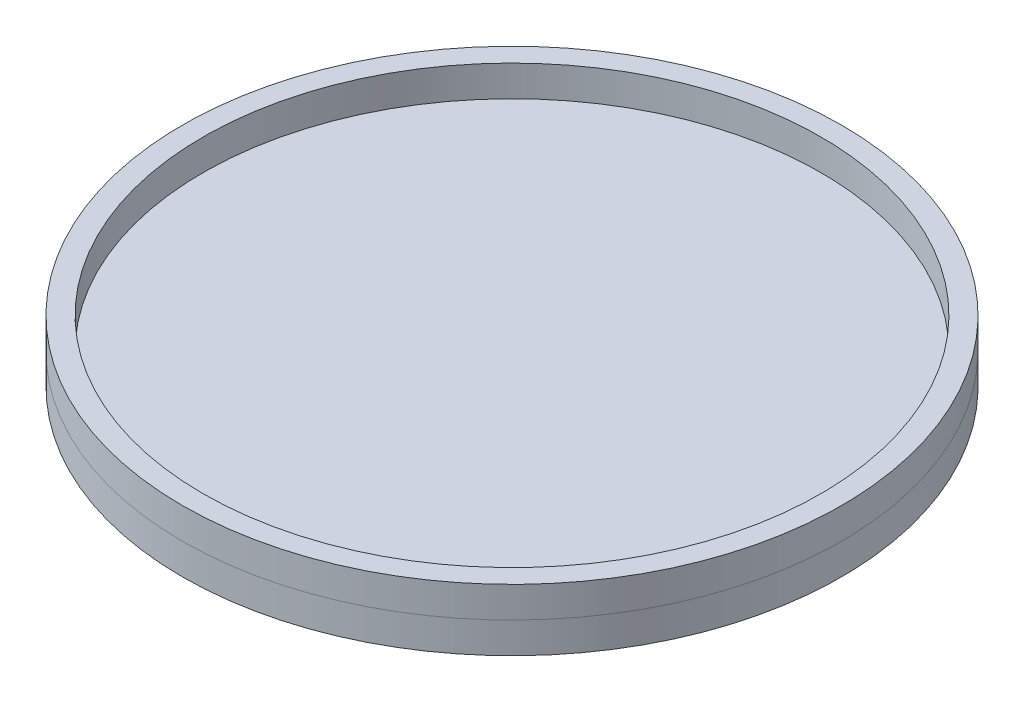
ISO-10303-21;
HEADER;
FILE_DESCRIPTION(('STEP AP214'),'2;1');
FILE_NAME('part.step','',(''),(''),'','','');
FILE_SCHEMA(('AUTOMOTIVE_DESIGN { 1 0 10303 214 1 1 1 1 }'));
ENDSEC;
DATA;
#1=APPLICATION_CONTEXT('core data for automotive mechanical design processes');
#2=APPLICATION_PROTOCOL_DEFINITION('international standard','automotive_design',2000,#1);
#3=PRODUCT_CONTEXT('',#1,'mechanical');
#4=PRODUCT('Part','Part','',(#3));
#5=PRODUCT_RELATED_PRODUCT_CATEGORY('part','',(#4));
#6=PRODUCT_DEFINITION_FORMATION('','',#4);
#7=PRODUCT_DEFINITION_CONTEXT('part definition',#1,'design');
#8=PRODUCT_DEFINITION('design','',#6,#7);
#9=PRODUCT_DEFINITION_SHAPE('','',#8);
#10=(LENGTH_UNIT() NAMED_UNIT(*) SI_UNIT(.MILLI.,.METRE.));
#11=(NAMED_UNIT(*) PLANE_ANGLE_UNIT() SI_UNIT($,.RADIAN.));
#12=(NAMED_UNIT(*) SI_UNIT($,.STERADIAN.) SOLID_ANGLE_UNIT());
#13=UNCERTAINTY_MEASURE_WITH_UNIT(LENGTH_MEASURE(1.E-05),#10,'distance_accuracy_value','');
#14=(GEOMETRIC_REPRESENTATION_CONTEXT(3) GLOBAL_UNCERTAINTY_ASSIGNED_CONTEXT((#13)) GLOBAL_UNIT_ASSIGNED_CONTEXT((#10,
#11,#12)) REPRESENTATION_CONTEXT('',''));
#15=CARTESIAN_POINT('',(0.,0.,0.));
#16=DIRECTION('',(0.,0.,1.));
#17=DIRECTION('',(1.,0.,0.));
#18=AXIS2_PLACEMENT_3D('',#15,#16,#17);
#19=CARTESIAN_POINT('',(25.6938172124433,34.1150134094887,50.74393548177));
#20=DIRECTION('',(0.,1.,0.));
#21=DIRECTION('',(0.,0.,1.));
#22=AXIS2_PLACEMENT_3D('',#19,#20,#21);
#23=PLANE('',#22);
#24=CARTESIAN_POINT('',(25.6938172124433,34.1150134094887,50.74393548177));
#25=DIRECTION('',(0.,1.,0.));
#26=DIRECTION('',(0.,0.,1.));
#27=AXIS2_PLACEMENT_3D('',#24,#25,#26);
#28=CIRCLE('',#27,32.);
#29=CARTESIAN_POINT('',(25.6938172124433,34.1150134094887,82.74393548177));
#30=VERTEX_POINT('',#29);
#31=EDGE_CURVE('P0_E9',#30,#30,#28,.T.);
#32=ORIENTED_EDGE('',*,*,#31,.T.);
#33=EDGE_LOOP('',(#32));
#34=FACE_BOUND('',#33,.T.);
#35=CARTESIAN_POINT('',(25.6938172124433,34.1150134094887,50.74393548177));
#36=DIRECTION('',(0.,1.,0.));
#37=DIRECTION('',(0.,0.,1.));
#38=AXIS2_PLACEMENT_3D('',#35,#36,#37);
#39=CIRCLE('',#38,30.);
#40=CARTESIAN_POINT('',(25.6938172124433,34.1150134094887,80.74393548177));
#41=VERTEX_POINT('',#40);
#42=EDGE_CURVE('P0_E25',#41,#41,#39,.T.);
#43=ORIENTED_EDGE('',*,*,#42,.F.);
#44=EDGE_LOOP('',(#43));
#45=FACE_BOUND('',#44,.T.);
#46=ADVANCED_FACE('P0_F14',(#34,#45),#23,.T.);
#47=CARTESIAN_POINT('',(25.6938172124433,31.1150134094887,50.74393548177));
#48=DIRECTION('',(0.,1.,0.));
#49=DIRECTION('',(0.,0.,1.));
#50=AXIS2_PLACEMENT_3D('',#47,#48,#49);
#51=PLANE('',#50);
#52=CARTESIAN_POINT('',(25.6938172124433,31.1150134094887,50.74393548177));
#53=DIRECTION('',(0.,1.,0.));
#54=DIRECTION('',(0.,0.,1.));
#55=AXIS2_PLACEMENT_3D('',#52,#53,#54);
#56=CIRCLE('',#55,32.);
#57=CARTESIAN_POINT('',(25.6938172124433,31.1150134094887,82.74393548177));
#58=VERTEX_POINT('',#57);
#59=EDGE_CURVE('P0_E18',#58,#58,#56,.T.);
#60=ORIENTED_EDGE('',*,*,#59,.F.);
#61=EDGE_LOOP('',(#60));
#62=FACE_BOUND('',#61,.T.);
#63=CARTESIAN_POINT('',(25.6938172124433,31.1150134094887,50.74393548177));
#64=DIRECTION('',(0.,1.,0.));
#65=DIRECTION('',(0.,0.,1.));
#66=AXIS2_PLACEMENT_3D('',#63,#64,#65);
#67=CIRCLE('',#66,30.);
#68=CARTESIAN_POINT('',(25.6938172124433,31.1150134094887,80.74393548177));
#69=VERTEX_POINT('',#68);
#70=EDGE_CURVE('P0_E27',#69,#69,#67,.T.);
#71=ORIENTED_EDGE('',*,*,#70,.T.);
#72=EDGE_LOOP('',(#71));
#73=FACE_BOUND('',#72,.T.);
#74=ADVANCED_FACE('P0_F37',(#62,#73),#51,.F.);
#75=CARTESIAN_POINT('',(25.6938172124433,34.1150134094887,50.74393548177));
#76=DIRECTION('',(0.,-1.,0.));
#77=DIRECTION('',(0.,0.,-1.));
#78=AXIS2_PLACEMENT_3D('',#75,#76,#77);
#79=CYLINDRICAL_SURFACE('',#78,32.);
#80=ORIENTED_EDGE('',*,*,#31,.F.);
#81=EDGE_LOOP('',(#80));
#82=FACE_BOUND('',#81,.T.);
#83=ORIENTED_EDGE('',*,*,#59,.T.);
#84=EDGE_LOOP('',(#83));
#85=FACE_BOUND('',#84,.T.);
#86=ADVANCED_FACE('P0_F16',(#82,#85),#79,.T.);
#87=CARTESIAN_POINT('',(25.6938172124433,34.1150134094887,50.74393548177));
#88=DIRECTION('',(0.,-1.,0.));
#89=DIRECTION('',(0.,0.,-1.));
#90=AXIS2_PLACEMENT_3D('',#87,#88,#89);
#91=CYLINDRICAL_SURFACE('',#90,30.);
#92=ORIENTED_EDGE('',*,*,#42,.T.);
#93=EDGE_LOOP('',(#92));
#94=FACE_BOUND('',#93,.T.);
#95=ORIENTED_EDGE('',*,*,#70,.F.);
#96=EDGE_LOOP('',(#95));
#97=FACE_BOUND('',#96,.T.);
#98=ADVANCED_FACE('P0_F33',(#94,#97),#91,.F.);
#99=CLOSED_SHELL('',(#46,#74,#86,#98));
#100=MANIFOLD_SOLID_BREP('P0_B1',#99);
#101=CARTESIAN_POINT('',(25.6938172124433,31.1150134094887,50.74393548177));
#102=DIRECTION('',(0.,-1.,0.));
#103=DIRECTION('',(0.,0.,-1.));
#104=AXIS2_PLACEMENT_3D('',#101,#102,#103);
#105=CYLINDRICAL_SURFACE('',#104,32.);
#106=CARTESIAN_POINT('',(25.6938172124433,31.1150134094887,50.74393548177));
#107=DIRECTION('',(0.,1.,0.));
#108=DIRECTION('',(0.,0.,1.));
#109=AXIS2_PLACEMENT_3D('',#106,#107,#108);
#110=CIRCLE('',#109,32.);
#111=CARTESIAN_POINT('',(25.6938172124433,31.1150134094887,82.74393548177));
#112=VERTEX_POINT('',#111);
#113=EDGE_CURVE('P1_E10',#112,#112,#110,.T.);
#114=ORIENTED_EDGE('',*,*,#113,.F.);
#115=EDGE_LOOP('',(#114));
#116=FACE_BOUND('',#115,.T.);
#117=CARTESIAN_POINT('',(25.6938172124433,28.1150134094887,50.74393548177));
#118=DIRECTION('',(0.,1.,0.));
#119=DIRECTION('',(0.,0.,1.));
#120=AXIS2_PLACEMENT_3D('',#117,#118,#119);
#121=CIRCLE('',#120,32.);
#122=CARTESIAN_POINT('',(25.6938172124433,28.1150134094887,82.74393548177));
#123=VERTEX_POINT('',#122);
#124=EDGE_CURVE('P1_E18',#123,#123,#121,.T.);
#125=ORIENTED_EDGE('',*,*,#124,.T.);
#126=EDGE_LOOP('',(#125));
#127=FACE_BOUND('',#126,.T.);
#128=ADVANCED_FACE('P1_F15',(#116,#127),#105,.T.);
#129=CARTESIAN_POINT('',(25.6938172124433,31.1150134094887,50.74393548177));
#130=DIRECTION('',(0.,1.,0.));
#131=DIRECTION('',(0.,0.,1.));
#132=AXIS2_PLACEMENT_3D('',#129,#130,#131);
#133=PLANE('',#132);
#134=ORIENTED_EDGE('',*,*,#113,.T.);
#135=EDGE_LOOP('',(#134));
#136=FACE_BOUND('',#135,.T.);
#137=ADVANCED_FACE('P1_F30',(#136),#133,.T.);
#138=CARTESIAN_POINT('',(25.6938172124433,28.1150134094887,50.74393548177));
#139=DIRECTION('',(0.,1.,0.));
#140=DIRECTION('',(0.,0.,1.));
#141=AXIS2_PLACEMENT_3D('',#138,#139,#140);
#142=PLANE('',#141);
#143=ORIENTED_EDGE('',*,*,#124,.F.);
#144=EDGE_LOOP('',(#143));
#145=FACE_BOUND('',#144,.T.);
#146=ADVANCED_FACE('P1_F28',(#145),#142,.F.);
#147=CLOSED_SHELL('',(#128,#137,#146));
#148=MANIFOLD_SOLID_BREP('P1_B1',#147);
#149=ADVANCED_BREP_SHAPE_REPRESENTATION('',(#18,#100,#148),#14);
#150=SHAPE_DEFINITION_REPRESENTATION(#9,#149);
ENDSEC;
END-ISO-10303-21;
